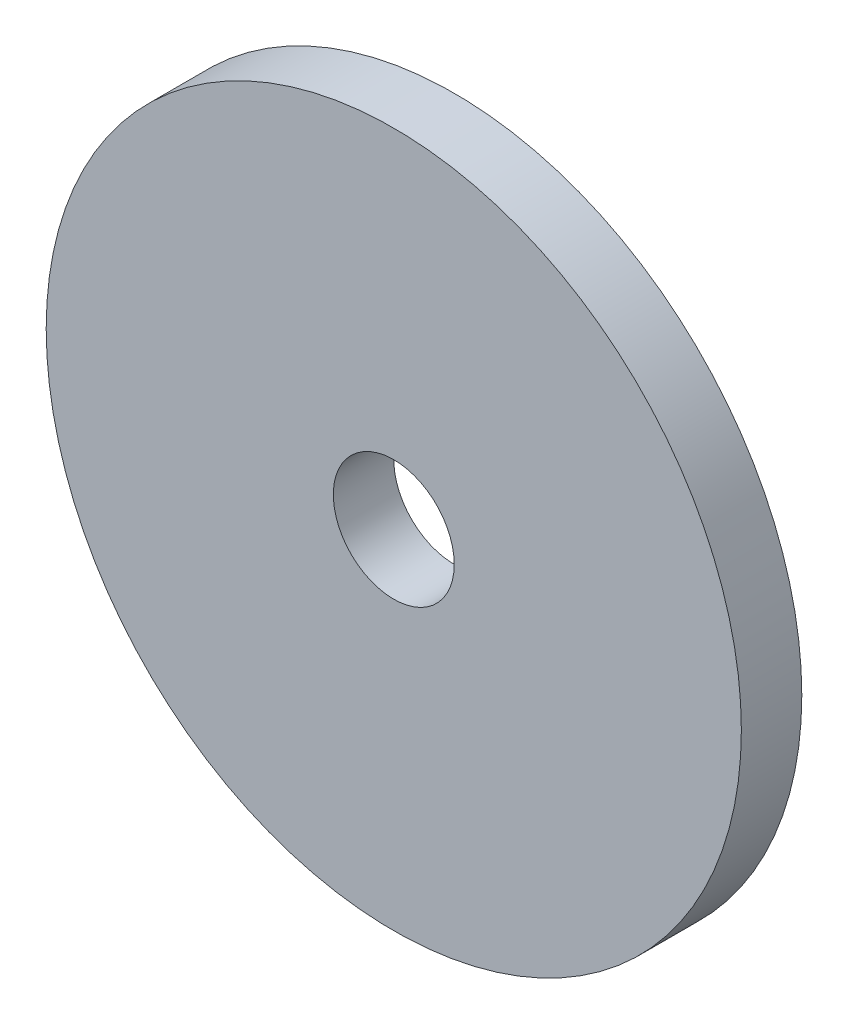
ISO-10303-21;
HEADER;
FILE_DESCRIPTION(('STEP AP214'),'2;1');
FILE_NAME('part.step','',(''),(''),'','','');
FILE_SCHEMA(('AUTOMOTIVE_DESIGN { 1 0 10303 214 1 1 1 1 }'));
ENDSEC;
DATA;
#1=APPLICATION_CONTEXT('core data for automotive mechanical design processes');
#2=APPLICATION_PROTOCOL_DEFINITION('international standard','automotive_design',2000,#1);
#3=PRODUCT_CONTEXT('',#1,'mechanical');
#4=PRODUCT('Part','Part','',(#3));
#5=PRODUCT_RELATED_PRODUCT_CATEGORY('part','',(#4));
#6=PRODUCT_DEFINITION_FORMATION('','',#4);
#7=PRODUCT_DEFINITION_CONTEXT('part definition',#1,'design');
#8=PRODUCT_DEFINITION('design','',#6,#7);
#9=PRODUCT_DEFINITION_SHAPE('','',#8);
#10=(LENGTH_UNIT() NAMED_UNIT(*) SI_UNIT(.MILLI.,.METRE.));
#11=(NAMED_UNIT(*) PLANE_ANGLE_UNIT() SI_UNIT($,.RADIAN.));
#12=(NAMED_UNIT(*) SI_UNIT($,.STERADIAN.) SOLID_ANGLE_UNIT());
#13=UNCERTAINTY_MEASURE_WITH_UNIT(LENGTH_MEASURE(1.E-05),#10,'distance_accuracy_value','');
#14=(GEOMETRIC_REPRESENTATION_CONTEXT(3) GLOBAL_UNCERTAINTY_ASSIGNED_CONTEXT((#13)) GLOBAL_UNIT_ASSIGNED_CONTEXT((#10,
#11,#12)) REPRESENTATION_CONTEXT('',''));
#15=CARTESIAN_POINT('',(0.,0.,0.));
#16=DIRECTION('',(0.,0.,1.));
#17=DIRECTION('',(1.,0.,0.));
#18=AXIS2_PLACEMENT_3D('',#15,#16,#17);
#19=CARTESIAN_POINT('',(0.,0.,0.5));
#20=DIRECTION('',(0.,0.,1.));
#21=DIRECTION('',(1.,0.,0.));
#22=AXIS2_PLACEMENT_3D('',#19,#20,#21);
#23=PLANE('',#22);
#24=CARTESIAN_POINT('',(0.,0.,0.5));
#25=DIRECTION('',(0.,0.,1.));
#26=DIRECTION('',(1.,0.,0.));
#27=AXIS2_PLACEMENT_3D('',#24,#25,#26);
#28=CIRCLE('',#27,5.75);
#29=CARTESIAN_POINT('',(5.75,0.,0.5));
#30=VERTEX_POINT('',#29);
#31=EDGE_CURVE('E10',#30,#30,#28,.T.);
#32=ORIENTED_EDGE('',*,*,#31,.T.);
#33=EDGE_LOOP('',(#32));
#34=FACE_BOUND('',#33,.T.);
#35=CARTESIAN_POINT('',(0.,0.,0.5));
#36=DIRECTION('',(0.,0.,1.));
#37=DIRECTION('',(1.,0.,0.));
#38=AXIS2_PLACEMENT_3D('',#35,#36,#37);
#39=CIRCLE('',#38,1.);
#40=CARTESIAN_POINT('',(1.,0.,0.5));
#41=VERTEX_POINT('',#40);
#42=EDGE_CURVE('E46',#41,#41,#39,.T.);
#43=ORIENTED_EDGE('',*,*,#42,.F.);
#44=EDGE_LOOP('',(#43));
#45=FACE_BOUND('',#44,.T.);
#46=ADVANCED_FACE('F35',(#34,#45),#23,.T.);
#47=CARTESIAN_POINT('',(0.,0.,-0.5));
#48=DIRECTION('',(0.,0.,1.));
#49=DIRECTION('',(1.,0.,0.));
#50=AXIS2_PLACEMENT_3D('',#47,#48,#49);
#51=PLANE('',#50);
#52=CARTESIAN_POINT('',(0.,0.,-0.5));
#53=DIRECTION('',(0.,0.,1.));
#54=DIRECTION('',(1.,0.,0.));
#55=AXIS2_PLACEMENT_3D('',#52,#53,#54);
#56=CIRCLE('',#55,5.75);
#57=CARTESIAN_POINT('',(5.75,0.,-0.5));
#58=VERTEX_POINT('',#57);
#59=EDGE_CURVE('E39',#58,#58,#56,.T.);
#60=ORIENTED_EDGE('',*,*,#59,.F.);
#61=EDGE_LOOP('',(#60));
#62=FACE_BOUND('',#61,.T.);
#63=CARTESIAN_POINT('',(0.,0.,-0.5));
#64=DIRECTION('',(0.,0.,1.));
#65=DIRECTION('',(1.,0.,0.));
#66=AXIS2_PLACEMENT_3D('',#63,#64,#65);
#67=CIRCLE('',#66,1.);
#68=CARTESIAN_POINT('',(1.,0.,-0.5));
#69=VERTEX_POINT('',#68);
#70=EDGE_CURVE('E48',#69,#69,#67,.T.);
#71=ORIENTED_EDGE('',*,*,#70,.T.);
#72=EDGE_LOOP('',(#71));
#73=FACE_BOUND('',#72,.T.);
#74=ADVANCED_FACE('F58',(#62,#73),#51,.F.);
#75=CARTESIAN_POINT('',(0.,0.,0.5));
#76=DIRECTION('',(0.,0.,-1.));
#77=DIRECTION('',(-1.,0.,0.));
#78=AXIS2_PLACEMENT_3D('',#75,#76,#77);
#79=CYLINDRICAL_SURFACE('',#78,5.75);
#80=ORIENTED_EDGE('',*,*,#31,.F.);
#81=EDGE_LOOP('',(#80));
#82=FACE_BOUND('',#81,.T.);
#83=ORIENTED_EDGE('',*,*,#59,.T.);
#84=EDGE_LOOP('',(#83));
#85=FACE_BOUND('',#84,.T.);
#86=ADVANCED_FACE('F37',(#82,#85),#79,.T.);
#87=CARTESIAN_POINT('',(0.,0.,0.5));
#88=DIRECTION('',(0.,0.,-1.));
#89=DIRECTION('',(-1.,0.,0.));
#90=AXIS2_PLACEMENT_3D('',#87,#88,#89);
#91=CYLINDRICAL_SURFACE('',#90,1.);
#92=ORIENTED_EDGE('',*,*,#42,.T.);
#93=EDGE_LOOP('',(#92));
#94=FACE_BOUND('',#93,.T.);
#95=ORIENTED_EDGE('',*,*,#70,.F.);
#96=EDGE_LOOP('',(#95));
#97=FACE_BOUND('',#96,.T.);
#98=ADVANCED_FACE('F54',(#94,#97),#91,.F.);
#99=CLOSED_SHELL('',(#46,#74,#86,#98));
#100=MANIFOLD_SOLID_BREP('B2',#99);
#101=ADVANCED_BREP_SHAPE_REPRESENTATION('',(#18,#100),#14);
#102=SHAPE_DEFINITION_REPRESENTATION(#9,#101);
ENDSEC;
END-ISO-10303-21;
